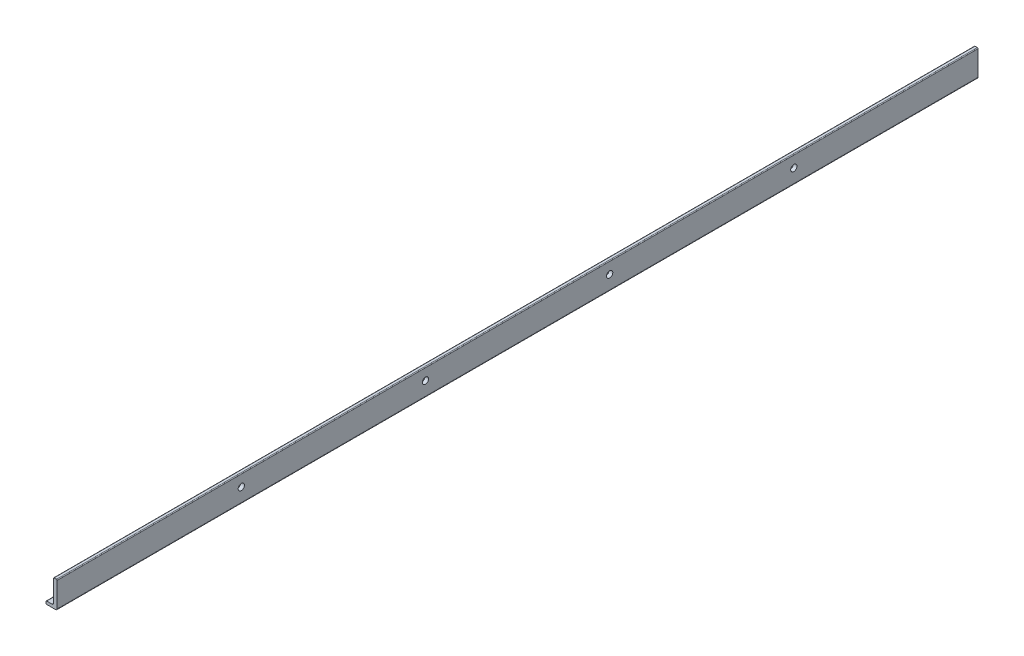
ISO-10303-21;
HEADER;
FILE_DESCRIPTION(('STEP AP214'),'2;1');
FILE_NAME('part.step','',(''),(''),'','','');
FILE_SCHEMA(('AUTOMOTIVE_DESIGN { 1 0 10303 214 1 1 1 1 }'));
ENDSEC;
DATA;
#1=APPLICATION_CONTEXT('core data for automotive mechanical design processes');
#2=APPLICATION_PROTOCOL_DEFINITION('international standard','automotive_design',2000,#1);
#3=PRODUCT_CONTEXT('',#1,'mechanical');
#4=PRODUCT('Part','Part','',(#3));
#5=PRODUCT_RELATED_PRODUCT_CATEGORY('part','',(#4));
#6=PRODUCT_DEFINITION_FORMATION('','',#4);
#7=PRODUCT_DEFINITION_CONTEXT('part definition',#1,'design');
#8=PRODUCT_DEFINITION('design','',#6,#7);
#9=PRODUCT_DEFINITION_SHAPE('','',#8);
#10=(LENGTH_UNIT() NAMED_UNIT(*) SI_UNIT(.MILLI.,.METRE.));
#11=(NAMED_UNIT(*) PLANE_ANGLE_UNIT() SI_UNIT($,.RADIAN.));
#12=(NAMED_UNIT(*) SI_UNIT($,.STERADIAN.) SOLID_ANGLE_UNIT());
#13=UNCERTAINTY_MEASURE_WITH_UNIT(LENGTH_MEASURE(1.E-05),#10,'distance_accuracy_value','');
#14=(GEOMETRIC_REPRESENTATION_CONTEXT(3) GLOBAL_UNCERTAINTY_ASSIGNED_CONTEXT((#13)) GLOBAL_UNIT_ASSIGNED_CONTEXT((#10,
#11,#12)) REPRESENTATION_CONTEXT('',''));
#15=CARTESIAN_POINT('',(0.,0.,0.));
#16=DIRECTION('',(0.,0.,1.));
#17=DIRECTION('',(1.,0.,0.));
#18=AXIS2_PLACEMENT_3D('',#15,#16,#17);
#19=CARTESIAN_POINT('',(-7.5,0.,620.));
#20=DIRECTION('',(0.,1.,0.));
#21=DIRECTION('',(0.,0.,1.));
#22=AXIS2_PLACEMENT_3D('',#19,#20,#21);
#23=PLANE('',#22);
#24=DIRECTION('',(1.,0.,0.));
#25=VECTOR('',#24,1.);
#26=CARTESIAN_POINT('',(-7.5,0.,620.));
#27=LINE('',#26,#25);
#28=CARTESIAN_POINT('',(-7.,0.,620.));
#29=VERTEX_POINT('',#28);
#30=CARTESIAN_POINT('',(-1.,0.,620.));
#31=VERTEX_POINT('',#30);
#32=EDGE_CURVE('E169',#29,#31,#27,.T.);
#33=ORIENTED_EDGE('',*,*,#32,.F.);
#34=DIRECTION('',(0.,0.,-1.));
#35=VECTOR('',#34,1.);
#36=CARTESIAN_POINT('',(-7.,0.,620.));
#37=LINE('',#36,#35);
#38=CARTESIAN_POINT('',(-7.,0.,0.));
#39=VERTEX_POINT('',#38);
#40=EDGE_CURVE('E209',#29,#39,#37,.T.);
#41=ORIENTED_EDGE('',*,*,#40,.T.);
#42=DIRECTION('',(1.,0.,0.));
#43=VECTOR('',#42,1.);
#44=CARTESIAN_POINT('',(-7.5,0.,0.));
#45=LINE('',#44,#43);
#46=CARTESIAN_POINT('',(-1.,0.,0.));
#47=VERTEX_POINT('',#46);
#48=EDGE_CURVE('E278',#39,#47,#45,.T.);
#49=ORIENTED_EDGE('',*,*,#48,.T.);
#50=DIRECTION('',(0.,0.,-1.));
#51=VECTOR('',#50,1.);
#52=CARTESIAN_POINT('',(-1.,0.,620.));
#53=LINE('',#52,#51);
#54=EDGE_CURVE('E201',#47,#31,#53,.F.);
#55=ORIENTED_EDGE('',*,*,#54,.T.);
#56=EDGE_LOOP('',(#33,#41,#49,#55));
#57=FACE_BOUND('',#56,.T.);
#58=ADVANCED_FACE('F45',(#57),#23,.F.);
#59=CARTESIAN_POINT('',(0.,0.,620.));
#60=DIRECTION('',(-1.,0.,0.));
#61=DIRECTION('',(0.,0.,1.));
#62=AXIS2_PLACEMENT_3D('',#59,#60,#61);
#63=PLANE('',#62);
#64=CARTESIAN_POINT('',(0.,10.,496.));
#65=DIRECTION('',(1.,0.,0.));
#66=DIRECTION('',(0.,0.,-1.));
#67=AXIS2_PLACEMENT_3D('',#64,#65,#66);
#68=CIRCLE('',#67,2.09999999999999);
#69=CARTESIAN_POINT('',(0.,10.,493.9));
#70=VERTEX_POINT('',#69);
#71=EDGE_CURVE('E189',#70,#70,#68,.T.);
#72=ORIENTED_EDGE('',*,*,#71,.F.);
#73=EDGE_LOOP('',(#72));
#74=FACE_BOUND('',#73,.T.);
#75=CARTESIAN_POINT('',(0.,10.,372.));
#76=DIRECTION('',(1.,0.,0.));
#77=DIRECTION('',(0.,0.,-1.));
#78=AXIS2_PLACEMENT_3D('',#75,#76,#77);
#79=CIRCLE('',#78,2.09999999999999);
#80=CARTESIAN_POINT('',(0.,10.,369.9));
#81=VERTEX_POINT('',#80);
#82=EDGE_CURVE('E185',#81,#81,#79,.T.);
#83=ORIENTED_EDGE('',*,*,#82,.F.);
#84=EDGE_LOOP('',(#83));
#85=FACE_BOUND('',#84,.T.);
#86=CARTESIAN_POINT('',(0.,10.,248.));
#87=DIRECTION('',(1.,0.,0.));
#88=DIRECTION('',(0.,0.,-1.));
#89=AXIS2_PLACEMENT_3D('',#86,#87,#88);
#90=CIRCLE('',#89,2.09999999999999);
#91=CARTESIAN_POINT('',(0.,10.,245.9));
#92=VERTEX_POINT('',#91);
#93=EDGE_CURVE('E180',#92,#92,#90,.T.);
#94=ORIENTED_EDGE('',*,*,#93,.F.);
#95=EDGE_LOOP('',(#94));
#96=FACE_BOUND('',#95,.T.);
#97=CARTESIAN_POINT('',(0.,10.,124.));
#98=DIRECTION('',(1.,0.,0.));
#99=DIRECTION('',(0.,0.,-1.));
#100=AXIS2_PLACEMENT_3D('',#97,#98,#99);
#101=CIRCLE('',#100,2.09999999999999);
#102=CARTESIAN_POINT('',(0.,10.,121.9));
#103=VERTEX_POINT('',#102);
#104=EDGE_CURVE('E179',#103,#103,#101,.T.);
#105=ORIENTED_EDGE('',*,*,#104,.F.);
#106=EDGE_LOOP('',(#105));
#107=FACE_BOUND('',#106,.T.);
#108=DIRECTION('',(0.,1.,0.));
#109=VECTOR('',#108,1.);
#110=CARTESIAN_POINT('',(0.,0.,0.));
#111=LINE('',#110,#109);
#112=CARTESIAN_POINT('',(0.,1.,0.));
#113=VERTEX_POINT('',#112);
#114=CARTESIAN_POINT('',(0.,17.5,0.));
#115=VERTEX_POINT('',#114);
#116=EDGE_CURVE('E276',#113,#115,#111,.T.);
#117=ORIENTED_EDGE('',*,*,#116,.T.);
#118=DIRECTION('',(0.,0.,-1.));
#119=VECTOR('',#118,1.);
#120=CARTESIAN_POINT('',(0.,17.5,620.));
#121=LINE('',#120,#119);
#122=CARTESIAN_POINT('',(0.,17.5,620.));
#123=VERTEX_POINT('',#122);
#124=EDGE_CURVE('E11',#115,#123,#121,.F.);
#125=ORIENTED_EDGE('',*,*,#124,.T.);
#126=DIRECTION('',(0.,1.,0.));
#127=VECTOR('',#126,1.);
#128=CARTESIAN_POINT('',(0.,0.,620.));
#129=LINE('',#128,#127);
#130=CARTESIAN_POINT('',(0.,1.,620.));
#131=VERTEX_POINT('',#130);
#132=EDGE_CURVE('E267',#131,#123,#129,.T.);
#133=ORIENTED_EDGE('',*,*,#132,.F.);
#134=DIRECTION('',(0.,0.,-1.));
#135=VECTOR('',#134,1.);
#136=CARTESIAN_POINT('',(0.,1.,620.));
#137=LINE('',#136,#135);
#138=EDGE_CURVE('E193',#131,#113,#137,.T.);
#139=ORIENTED_EDGE('',*,*,#138,.T.);
#140=EDGE_LOOP('',(#117,#125,#133,#139));
#141=FACE_BOUND('',#140,.T.);
#142=ADVANCED_FACE('F313',(#74,#85,#96,#107,#141),#63,.F.);
#143=CARTESIAN_POINT('',(0.,18.,620.));
#144=DIRECTION('',(0.,-1.,0.));
#145=DIRECTION('',(0.,0.,-1.));
#146=AXIS2_PLACEMENT_3D('',#143,#144,#145);
#147=PLANE('',#146);
#148=DIRECTION('',(-1.,0.,0.));
#149=VECTOR('',#148,1.);
#150=CARTESIAN_POINT('',(0.,18.,0.));
#151=LINE('',#150,#149);
#152=CARTESIAN_POINT('',(-0.5,18.,0.));
#153=VERTEX_POINT('',#152);
#154=CARTESIAN_POINT('',(-2.,18.,0.));
#155=VERTEX_POINT('',#154);
#156=EDGE_CURVE('E171',#153,#155,#151,.T.);
#157=ORIENTED_EDGE('',*,*,#156,.T.);
#158=DIRECTION('',(0.,0.,-1.));
#159=VECTOR('',#158,1.);
#160=CARTESIAN_POINT('',(-2.,18.,620.));
#161=LINE('',#160,#159);
#162=CARTESIAN_POINT('',(-2.,18.,620.));
#163=VERTEX_POINT('',#162);
#164=EDGE_CURVE('E54',#155,#163,#161,.F.);
#165=ORIENTED_EDGE('',*,*,#164,.T.);
#166=DIRECTION('',(-1.,0.,0.));
#167=VECTOR('',#166,1.);
#168=CARTESIAN_POINT('',(0.,18.,620.));
#169=LINE('',#168,#167);
#170=CARTESIAN_POINT('',(-0.5,18.,620.));
#171=VERTEX_POINT('',#170);
#172=EDGE_CURVE('E257',#171,#163,#169,.T.);
#173=ORIENTED_EDGE('',*,*,#172,.F.);
#174=DIRECTION('',(0.,0.,-1.));
#175=VECTOR('',#174,1.);
#176=CARTESIAN_POINT('',(-0.5,18.,620.));
#177=LINE('',#176,#175);
#178=EDGE_CURVE('E248',#171,#153,#177,.T.);
#179=ORIENTED_EDGE('',*,*,#178,.T.);
#180=EDGE_LOOP('',(#157,#165,#173,#179));
#181=FACE_BOUND('',#180,.T.);
#182=ADVANCED_FACE('F256',(#181),#147,.F.);
#183=CARTESIAN_POINT('',(-2.5,18.,620.));
#184=DIRECTION('',(1.,0.,0.));
#185=DIRECTION('',(0.,1.,0.));
#186=AXIS2_PLACEMENT_3D('',#183,#184,#185);
#187=PLANE('',#186);
#188=CARTESIAN_POINT('',(-2.5,10.,496.));
#189=DIRECTION('',(1.,0.,0.));
#190=DIRECTION('',(0.,1.,0.));
#191=AXIS2_PLACEMENT_3D('',#188,#189,#190);
#192=CIRCLE('',#191,2.09999999999999);
#193=CARTESIAN_POINT('',(-2.5,12.1,496.));
#194=VERTEX_POINT('',#193);
#195=EDGE_CURVE('E186',#194,#194,#192,.T.);
#196=ORIENTED_EDGE('',*,*,#195,.T.);
#197=EDGE_LOOP('',(#196));
#198=FACE_BOUND('',#197,.T.);
#199=CARTESIAN_POINT('',(-2.5,10.,372.));
#200=DIRECTION('',(1.,0.,0.));
#201=DIRECTION('',(0.,1.,0.));
#202=AXIS2_PLACEMENT_3D('',#199,#200,#201);
#203=CIRCLE('',#202,2.09999999999999);
#204=CARTESIAN_POINT('',(-2.5,12.1,372.));
#205=VERTEX_POINT('',#204);
#206=EDGE_CURVE('E181',#205,#205,#203,.T.);
#207=ORIENTED_EDGE('',*,*,#206,.T.);
#208=EDGE_LOOP('',(#207));
#209=FACE_BOUND('',#208,.T.);
#210=CARTESIAN_POINT('',(-2.5,10.,248.));
#211=DIRECTION('',(1.,0.,0.));
#212=DIRECTION('',(0.,1.,0.));
#213=AXIS2_PLACEMENT_3D('',#210,#211,#212);
#214=CIRCLE('',#213,2.09999999999999);
#215=CARTESIAN_POINT('',(-2.5,12.1,248.));
#216=VERTEX_POINT('',#215);
#217=EDGE_CURVE('E175',#216,#216,#214,.T.);
#218=ORIENTED_EDGE('',*,*,#217,.T.);
#219=EDGE_LOOP('',(#218));
#220=FACE_BOUND('',#219,.T.);
#221=CARTESIAN_POINT('',(-2.5,10.,124.));
#222=DIRECTION('',(1.,0.,0.));
#223=DIRECTION('',(0.,1.,0.));
#224=AXIS2_PLACEMENT_3D('',#221,#222,#223);
#225=CIRCLE('',#224,2.09999999999999);
#226=CARTESIAN_POINT('',(-2.5,12.1,124.));
#227=VERTEX_POINT('',#226);
#228=EDGE_CURVE('E283',#227,#227,#225,.T.);
#229=ORIENTED_EDGE('',*,*,#228,.T.);
#230=EDGE_LOOP('',(#229));
#231=FACE_BOUND('',#230,.T.);
#232=DIRECTION('',(0.,-1.,0.));
#233=VECTOR('',#232,1.);
#234=CARTESIAN_POINT('',(-2.5,18.,620.));
#235=LINE('',#234,#233);
#236=CARTESIAN_POINT('',(-2.5,17.5,620.));
#237=VERTEX_POINT('',#236);
#238=CARTESIAN_POINT('',(-2.5,3.,620.));
#239=VERTEX_POINT('',#238);
#240=EDGE_CURVE('E266',#237,#239,#235,.T.);
#241=ORIENTED_EDGE('',*,*,#240,.F.);
#242=DIRECTION('',(0.,0.,-1.));
#243=VECTOR('',#242,1.);
#244=CARTESIAN_POINT('',(-2.5,17.5,620.));
#245=LINE('',#244,#243);
#246=CARTESIAN_POINT('',(-2.5,17.5,0.));
#247=VERTEX_POINT('',#246);
#248=EDGE_CURVE('E244',#237,#247,#245,.T.);
#249=ORIENTED_EDGE('',*,*,#248,.T.);
#250=DIRECTION('',(0.,-1.,0.));
#251=VECTOR('',#250,1.);
#252=CARTESIAN_POINT('',(-2.5,18.,0.));
#253=LINE('',#252,#251);
#254=CARTESIAN_POINT('',(-2.5,3.,0.));
#255=VERTEX_POINT('',#254);
#256=EDGE_CURVE('E164',#247,#255,#253,.T.);
#257=ORIENTED_EDGE('',*,*,#256,.T.);
#258=DIRECTION('',(0.,0.,-1.));
#259=VECTOR('',#258,1.);
#260=CARTESIAN_POINT('',(-2.5,3.,620.));
#261=LINE('',#260,#259);
#262=EDGE_CURVE('E144',#255,#239,#261,.F.);
#263=ORIENTED_EDGE('',*,*,#262,.T.);
#264=EDGE_LOOP('',(#241,#249,#257,#263));
#265=FACE_BOUND('',#264,.T.);
#266=ADVANCED_FACE('F272',(#198,#209,#220,#231,#265),#187,.F.);
#267=CARTESIAN_POINT('',(-2.5,2.,620.));
#268=DIRECTION('',(0.,-1.,0.));
#269=DIRECTION('',(1.,0.,0.));
#270=AXIS2_PLACEMENT_3D('',#267,#268,#269);
#271=PLANE('',#270);
#272=DIRECTION('',(-1.,0.,0.));
#273=VECTOR('',#272,1.);
#274=CARTESIAN_POINT('',(-2.5,2.,0.));
#275=LINE('',#274,#273);
#276=CARTESIAN_POINT('',(-3.5,2.,0.));
#277=VERTEX_POINT('',#276);
#278=CARTESIAN_POINT('',(-7.,2.,0.));
#279=VERTEX_POINT('',#278);
#280=EDGE_CURVE('E153',#277,#279,#275,.T.);
#281=ORIENTED_EDGE('',*,*,#280,.T.);
#282=DIRECTION('',(0.,0.,-1.));
#283=VECTOR('',#282,1.);
#284=CARTESIAN_POINT('',(-7.,2.,620.));
#285=LINE('',#284,#283);
#286=CARTESIAN_POINT('',(-7.,2.,620.));
#287=VERTEX_POINT('',#286);
#288=EDGE_CURVE('E61',#279,#287,#285,.F.);
#289=ORIENTED_EDGE('',*,*,#288,.T.);
#290=DIRECTION('',(-1.,0.,0.));
#291=VECTOR('',#290,1.);
#292=CARTESIAN_POINT('',(-2.5,2.,620.));
#293=LINE('',#292,#291);
#294=CARTESIAN_POINT('',(-3.5,2.,620.));
#295=VERTEX_POINT('',#294);
#296=EDGE_CURVE('E154',#295,#287,#293,.T.);
#297=ORIENTED_EDGE('',*,*,#296,.F.);
#298=DIRECTION('',(0.,0.,-1.));
#299=VECTOR('',#298,1.);
#300=CARTESIAN_POINT('',(-3.5,2.,0.));
#301=LINE('',#300,#299);
#302=EDGE_CURVE('E142',#295,#277,#301,.T.);
#303=ORIENTED_EDGE('',*,*,#302,.T.);
#304=EDGE_LOOP('',(#281,#289,#297,#303));
#305=FACE_BOUND('',#304,.T.);
#306=ADVANCED_FACE('F152',(#305),#271,.F.);
#307=CARTESIAN_POINT('',(-7.5,2.,620.));
#308=DIRECTION('',(1.,0.,0.));
#309=DIRECTION('',(0.,0.,-1.));
#310=AXIS2_PLACEMENT_3D('',#307,#308,#309);
#311=PLANE('',#310);
#312=DIRECTION('',(0.,-1.,0.));
#313=VECTOR('',#312,1.);
#314=CARTESIAN_POINT('',(-7.5,2.,0.));
#315=LINE('',#314,#313);
#316=CARTESIAN_POINT('',(-7.5,1.5,0.));
#317=VERTEX_POINT('',#316);
#318=CARTESIAN_POINT('',(-7.5,0.5,0.));
#319=VERTEX_POINT('',#318);
#320=EDGE_CURVE('E163',#317,#319,#315,.T.);
#321=ORIENTED_EDGE('',*,*,#320,.T.);
#322=DIRECTION('',(0.,0.,-1.));
#323=VECTOR('',#322,1.);
#324=CARTESIAN_POINT('',(-7.5,0.5,620.));
#325=LINE('',#324,#323);
#326=CARTESIAN_POINT('',(-7.5,0.5,620.));
#327=VERTEX_POINT('',#326);
#328=EDGE_CURVE('E228',#319,#327,#325,.F.);
#329=ORIENTED_EDGE('',*,*,#328,.T.);
#330=DIRECTION('',(0.,-1.,0.));
#331=VECTOR('',#330,1.);
#332=CARTESIAN_POINT('',(-7.5,2.,620.));
#333=LINE('',#332,#331);
#334=CARTESIAN_POINT('',(-7.5,1.5,620.));
#335=VERTEX_POINT('',#334);
#336=EDGE_CURVE('E156',#335,#327,#333,.T.);
#337=ORIENTED_EDGE('',*,*,#336,.F.);
#338=DIRECTION('',(0.,0.,-1.));
#339=VECTOR('',#338,1.);
#340=CARTESIAN_POINT('',(-7.5,1.5,620.));
#341=LINE('',#340,#339);
#342=EDGE_CURVE('E224',#335,#317,#341,.T.);
#343=ORIENTED_EDGE('',*,*,#342,.T.);
#344=EDGE_LOOP('',(#321,#329,#337,#343));
#345=FACE_BOUND('',#344,.T.);
#346=ADVANCED_FACE('F359',(#345),#311,.F.);
#347=CARTESIAN_POINT('',(0.,0.,620.));
#348=DIRECTION('',(0.,0.,1.));
#349=DIRECTION('',(1.,0.,0.));
#350=AXIS2_PLACEMENT_3D('',#347,#348,#349);
#351=PLANE('',#350);
#352=ORIENTED_EDGE('',*,*,#336,.T.);
#353=CARTESIAN_POINT('',(-7.,0.5,620.));
#354=DIRECTION('',(0.,0.,1.));
#355=DIRECTION('',(1.,0.,0.));
#356=AXIS2_PLACEMENT_3D('',#353,#354,#355);
#357=CIRCLE('',#356,0.5);
#358=EDGE_CURVE('E239',#327,#29,#357,.T.);
#359=ORIENTED_EDGE('',*,*,#358,.T.);
#360=ORIENTED_EDGE('',*,*,#32,.T.);
#361=CARTESIAN_POINT('',(-1.,1.,620.));
#362=DIRECTION('',(0.,0.,1.));
#363=DIRECTION('',(1.,0.,0.));
#364=AXIS2_PLACEMENT_3D('',#361,#362,#363);
#365=CIRCLE('',#364,1.);
#366=EDGE_CURVE('E150',#31,#131,#365,.T.);
#367=ORIENTED_EDGE('',*,*,#366,.T.);
#368=ORIENTED_EDGE('',*,*,#132,.T.);
#369=CARTESIAN_POINT('',(-0.5,17.5,620.));
#370=DIRECTION('',(0.,0.,1.));
#371=DIRECTION('',(1.,0.,0.));
#372=AXIS2_PLACEMENT_3D('',#369,#370,#371);
#373=CIRCLE('',#372,0.5);
#374=EDGE_CURVE('E231',#123,#171,#373,.T.);
#375=ORIENTED_EDGE('',*,*,#374,.T.);
#376=ORIENTED_EDGE('',*,*,#172,.T.);
#377=CARTESIAN_POINT('',(-2.,17.5,620.));
#378=DIRECTION('',(0.,0.,1.));
#379=DIRECTION('',(1.,0.,0.));
#380=AXIS2_PLACEMENT_3D('',#377,#378,#379);
#381=CIRCLE('',#380,0.5);
#382=EDGE_CURVE('E69',#163,#237,#381,.T.);
#383=ORIENTED_EDGE('',*,*,#382,.T.);
#384=ORIENTED_EDGE('',*,*,#240,.T.);
#385=CARTESIAN_POINT('',(-3.5,3.,620.));
#386=DIRECTION('',(0.,0.,1.));
#387=DIRECTION('',(1.,0.,0.));
#388=AXIS2_PLACEMENT_3D('',#385,#386,#387);
#389=CIRCLE('',#388,1.);
#390=EDGE_CURVE('E149',#239,#295,#389,.F.);
#391=ORIENTED_EDGE('',*,*,#390,.T.);
#392=ORIENTED_EDGE('',*,*,#296,.T.);
#393=CARTESIAN_POINT('',(-7.,1.5,620.));
#394=DIRECTION('',(0.,0.,1.));
#395=DIRECTION('',(1.,0.,0.));
#396=AXIS2_PLACEMENT_3D('',#393,#394,#395);
#397=CIRCLE('',#396,0.5);
#398=EDGE_CURVE('E236',#287,#335,#397,.T.);
#399=ORIENTED_EDGE('',*,*,#398,.T.);
#400=EDGE_LOOP('',(#352,#359,#360,#367,#368,#375,#376,#383,#384,#391,#392,#399));
#401=FACE_BOUND('',#400,.T.);
#402=ADVANCED_FACE('F262',(#401),#351,.T.);
#403=CARTESIAN_POINT('',(0.,0.,0.));
#404=DIRECTION('',(0.,0.,1.));
#405=DIRECTION('',(1.,0.,0.));
#406=AXIS2_PLACEMENT_3D('',#403,#404,#405);
#407=PLANE('',#406);
#408=ORIENTED_EDGE('',*,*,#48,.F.);
#409=CARTESIAN_POINT('',(-7.,0.5,0.));
#410=DIRECTION('',(0.,0.,1.));
#411=DIRECTION('',(1.,0.,0.));
#412=AXIS2_PLACEMENT_3D('',#409,#410,#411);
#413=CIRCLE('',#412,0.5);
#414=EDGE_CURVE('E221',#39,#319,#413,.F.);
#415=ORIENTED_EDGE('',*,*,#414,.T.);
#416=ORIENTED_EDGE('',*,*,#320,.F.);
#417=CARTESIAN_POINT('',(-7.,1.5,0.));
#418=DIRECTION('',(0.,0.,1.));
#419=DIRECTION('',(1.,0.,0.));
#420=AXIS2_PLACEMENT_3D('',#417,#418,#419);
#421=CIRCLE('',#420,0.5);
#422=EDGE_CURVE('E161',#317,#279,#421,.F.);
#423=ORIENTED_EDGE('',*,*,#422,.T.);
#424=ORIENTED_EDGE('',*,*,#280,.F.);
#425=CARTESIAN_POINT('',(-3.5,3.,0.));
#426=DIRECTION('',(0.,0.,1.));
#427=DIRECTION('',(1.,0.,0.));
#428=AXIS2_PLACEMENT_3D('',#425,#426,#427);
#429=CIRCLE('',#428,1.);
#430=EDGE_CURVE('E138',#277,#255,#429,.T.);
#431=ORIENTED_EDGE('',*,*,#430,.T.);
#432=ORIENTED_EDGE('',*,*,#256,.F.);
#433=CARTESIAN_POINT('',(-2.,17.5,0.));
#434=DIRECTION('',(0.,0.,1.));
#435=DIRECTION('',(1.,0.,0.));
#436=AXIS2_PLACEMENT_3D('',#433,#434,#435);
#437=CIRCLE('',#436,0.5);
#438=EDGE_CURVE('E216',#247,#155,#437,.F.);
#439=ORIENTED_EDGE('',*,*,#438,.T.);
#440=ORIENTED_EDGE('',*,*,#156,.F.);
#441=CARTESIAN_POINT('',(-0.5,17.5,0.));
#442=DIRECTION('',(0.,0.,1.));
#443=DIRECTION('',(1.,0.,0.));
#444=AXIS2_PLACEMENT_3D('',#441,#442,#443);
#445=CIRCLE('',#444,0.5);
#446=EDGE_CURVE('E213',#153,#115,#445,.F.);
#447=ORIENTED_EDGE('',*,*,#446,.T.);
#448=ORIENTED_EDGE('',*,*,#116,.F.);
#449=CARTESIAN_POINT('',(-1.,1.,0.));
#450=DIRECTION('',(0.,0.,1.));
#451=DIRECTION('',(1.,0.,0.));
#452=AXIS2_PLACEMENT_3D('',#449,#450,#451);
#453=CIRCLE('',#452,1.);
#454=EDGE_CURVE('E197',#113,#47,#453,.F.);
#455=ORIENTED_EDGE('',*,*,#454,.T.);
#456=EDGE_LOOP('',(#408,#415,#416,#423,#424,#431,#432,#439,#440,#447,#448,#455));
#457=FACE_BOUND('',#456,.T.);
#458=ADVANCED_FACE('F159',(#457),#407,.F.);
#459=CARTESIAN_POINT('',(0.,10.,124.));
#460=DIRECTION('',(1.,0.,0.));
#461=DIRECTION('',(0.,0.,-1.));
#462=AXIS2_PLACEMENT_3D('',#459,#460,#461);
#463=CYLINDRICAL_SURFACE('',#462,2.09999999999999);
#464=ORIENTED_EDGE('',*,*,#104,.T.);
#465=EDGE_LOOP('',(#464));
#466=FACE_BOUND('',#465,.T.);
#467=ORIENTED_EDGE('',*,*,#228,.F.);
#468=EDGE_LOOP('',(#467));
#469=FACE_BOUND('',#468,.T.);
#470=ADVANCED_FACE('F408',(#466,#469),#463,.F.);
#471=CARTESIAN_POINT('',(0.,10.,248.));
#472=DIRECTION('',(1.,0.,0.));
#473=DIRECTION('',(0.,0.,-1.));
#474=AXIS2_PLACEMENT_3D('',#471,#472,#473);
#475=CYLINDRICAL_SURFACE('',#474,2.09999999999999);
#476=ORIENTED_EDGE('',*,*,#93,.T.);
#477=EDGE_LOOP('',(#476));
#478=FACE_BOUND('',#477,.T.);
#479=ORIENTED_EDGE('',*,*,#217,.F.);
#480=EDGE_LOOP('',(#479));
#481=FACE_BOUND('',#480,.T.);
#482=ADVANCED_FACE('F453',(#478,#481),#475,.F.);
#483=CARTESIAN_POINT('',(0.,10.,372.));
#484=DIRECTION('',(1.,0.,0.));
#485=DIRECTION('',(0.,0.,-1.));
#486=AXIS2_PLACEMENT_3D('',#483,#484,#485);
#487=CYLINDRICAL_SURFACE('',#486,2.09999999999999);
#488=ORIENTED_EDGE('',*,*,#82,.T.);
#489=EDGE_LOOP('',(#488));
#490=FACE_BOUND('',#489,.T.);
#491=ORIENTED_EDGE('',*,*,#206,.F.);
#492=EDGE_LOOP('',(#491));
#493=FACE_BOUND('',#492,.T.);
#494=ADVANCED_FACE('F446',(#490,#493),#487,.F.);
#495=CARTESIAN_POINT('',(0.,10.,496.));
#496=DIRECTION('',(1.,0.,0.));
#497=DIRECTION('',(0.,0.,-1.));
#498=AXIS2_PLACEMENT_3D('',#495,#496,#497);
#499=CYLINDRICAL_SURFACE('',#498,2.09999999999999);
#500=ORIENTED_EDGE('',*,*,#71,.T.);
#501=EDGE_LOOP('',(#500));
#502=FACE_BOUND('',#501,.T.);
#503=ORIENTED_EDGE('',*,*,#195,.F.);
#504=EDGE_LOOP('',(#503));
#505=FACE_BOUND('',#504,.T.);
#506=ADVANCED_FACE('F310',(#502,#505),#499,.F.);
#507=CARTESIAN_POINT('',(-3.5,3.,620.));
#508=DIRECTION('',(0.,0.,1.));
#509=DIRECTION('',(1.,0.,0.));
#510=AXIS2_PLACEMENT_3D('',#507,#508,#509);
#511=CYLINDRICAL_SURFACE('',#510,1.);
#512=ORIENTED_EDGE('',*,*,#390,.F.);
#513=ORIENTED_EDGE('',*,*,#262,.F.);
#514=ORIENTED_EDGE('',*,*,#430,.F.);
#515=ORIENTED_EDGE('',*,*,#302,.F.);
#516=EDGE_LOOP('',(#512,#513,#514,#515));
#517=FACE_BOUND('',#516,.T.);
#518=ADVANCED_FACE('F141',(#517),#511,.F.);
#519=CARTESIAN_POINT('',(-1.,1.,620.));
#520=DIRECTION('',(0.,0.,-1.));
#521=DIRECTION('',(-1.,0.,0.));
#522=AXIS2_PLACEMENT_3D('',#519,#520,#521);
#523=CYLINDRICAL_SURFACE('',#522,1.);
#524=ORIENTED_EDGE('',*,*,#366,.F.);
#525=ORIENTED_EDGE('',*,*,#54,.F.);
#526=ORIENTED_EDGE('',*,*,#454,.F.);
#527=ORIENTED_EDGE('',*,*,#138,.F.);
#528=EDGE_LOOP('',(#524,#525,#526,#527));
#529=FACE_BOUND('',#528,.T.);
#530=ADVANCED_FACE('F342',(#529),#523,.T.);
#531=CARTESIAN_POINT('',(-7.,0.5,620.));
#532=DIRECTION('',(0.,0.,-1.));
#533=DIRECTION('',(-1.,0.,0.));
#534=AXIS2_PLACEMENT_3D('',#531,#532,#533);
#535=CYLINDRICAL_SURFACE('',#534,0.5);
#536=ORIENTED_EDGE('',*,*,#358,.F.);
#537=ORIENTED_EDGE('',*,*,#328,.F.);
#538=ORIENTED_EDGE('',*,*,#414,.F.);
#539=ORIENTED_EDGE('',*,*,#40,.F.);
#540=EDGE_LOOP('',(#536,#537,#538,#539));
#541=FACE_BOUND('',#540,.T.);
#542=ADVANCED_FACE('F345',(#541),#535,.T.);
#543=CARTESIAN_POINT('',(-7.,1.5,620.));
#544=DIRECTION('',(0.,0.,-1.));
#545=DIRECTION('',(-1.,0.,0.));
#546=AXIS2_PLACEMENT_3D('',#543,#544,#545);
#547=CYLINDRICAL_SURFACE('',#546,0.5);
#548=ORIENTED_EDGE('',*,*,#398,.F.);
#549=ORIENTED_EDGE('',*,*,#288,.F.);
#550=ORIENTED_EDGE('',*,*,#422,.F.);
#551=ORIENTED_EDGE('',*,*,#342,.F.);
#552=EDGE_LOOP('',(#548,#549,#550,#551));
#553=FACE_BOUND('',#552,.T.);
#554=ADVANCED_FACE('F331',(#553),#547,.T.);
#555=CARTESIAN_POINT('',(-2.,17.5,620.));
#556=DIRECTION('',(0.,0.,-1.));
#557=DIRECTION('',(-1.,0.,0.));
#558=AXIS2_PLACEMENT_3D('',#555,#556,#557);
#559=CYLINDRICAL_SURFACE('',#558,0.5);
#560=ORIENTED_EDGE('',*,*,#382,.F.);
#561=ORIENTED_EDGE('',*,*,#164,.F.);
#562=ORIENTED_EDGE('',*,*,#438,.F.);
#563=ORIENTED_EDGE('',*,*,#248,.F.);
#564=EDGE_LOOP('',(#560,#561,#562,#563));
#565=FACE_BOUND('',#564,.T.);
#566=ADVANCED_FACE('F270',(#565),#559,.T.);
#567=CARTESIAN_POINT('',(-0.5,17.5,620.));
#568=DIRECTION('',(0.,0.,-1.));
#569=DIRECTION('',(-1.,0.,0.));
#570=AXIS2_PLACEMENT_3D('',#567,#568,#569);
#571=CYLINDRICAL_SURFACE('',#570,0.5);
#572=ORIENTED_EDGE('',*,*,#374,.F.);
#573=ORIENTED_EDGE('',*,*,#124,.F.);
#574=ORIENTED_EDGE('',*,*,#446,.F.);
#575=ORIENTED_EDGE('',*,*,#178,.F.);
#576=EDGE_LOOP('',(#572,#573,#574,#575));
#577=FACE_BOUND('',#576,.T.);
#578=ADVANCED_FACE('F47',(#577),#571,.T.);
#579=CLOSED_SHELL('',(#58,#142,#182,#266,#306,#346,#402,#458,#470,#482,#494,#506,#518,#530,#542,
#554,#566,#578));
#580=MANIFOLD_SOLID_BREP('B2',#579);
#581=ADVANCED_BREP_SHAPE_REPRESENTATION('',(#18,#580),#14);
#582=SHAPE_DEFINITION_REPRESENTATION(#9,#581);
ENDSEC;
END-ISO-10303-21;
